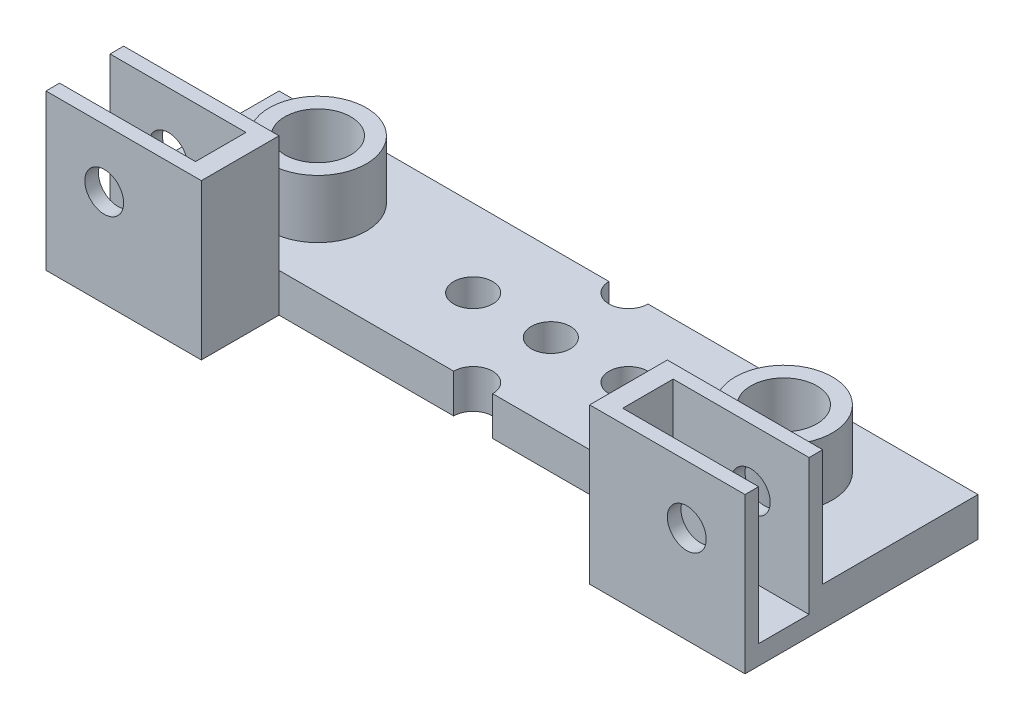
ISO-10303-21;
HEADER;
FILE_DESCRIPTION(('STEP AP214'),'2;1');
FILE_NAME('part.step','',(''),(''),'','','');
FILE_SCHEMA(('AUTOMOTIVE_DESIGN { 1 0 10303 214 1 1 1 1 }'));
ENDSEC;
DATA;
#1=APPLICATION_CONTEXT('core data for automotive mechanical design processes');
#2=APPLICATION_PROTOCOL_DEFINITION('international standard','automotive_design',2000,#1);
#3=PRODUCT_CONTEXT('',#1,'mechanical');
#4=PRODUCT('Part','Part','',(#3));
#5=PRODUCT_RELATED_PRODUCT_CATEGORY('part','',(#4));
#6=PRODUCT_DEFINITION_FORMATION('','',#4);
#7=PRODUCT_DEFINITION_CONTEXT('part definition',#1,'design');
#8=PRODUCT_DEFINITION('design','',#6,#7);
#9=PRODUCT_DEFINITION_SHAPE('','',#8);
#10=(LENGTH_UNIT() NAMED_UNIT(*) SI_UNIT(.MILLI.,.METRE.));
#11=(NAMED_UNIT(*) PLANE_ANGLE_UNIT() SI_UNIT($,.RADIAN.));
#12=(NAMED_UNIT(*) SI_UNIT($,.STERADIAN.) SOLID_ANGLE_UNIT());
#13=UNCERTAINTY_MEASURE_WITH_UNIT(LENGTH_MEASURE(1.E-05),#10,'distance_accuracy_value','');
#14=(GEOMETRIC_REPRESENTATION_CONTEXT(3) GLOBAL_UNCERTAINTY_ASSIGNED_CONTEXT((#13)) GLOBAL_UNIT_ASSIGNED_CONTEXT((#10,
#11,#12)) REPRESENTATION_CONTEXT('',''));
#15=CARTESIAN_POINT('',(0.,0.,0.));
#16=DIRECTION('',(0.,0.,1.));
#17=DIRECTION('',(1.,0.,0.));
#18=AXIS2_PLACEMENT_3D('',#15,#16,#17);
#19=CARTESIAN_POINT('',(45.,5.,0.));
#20=DIRECTION('',(1.,0.,0.));
#21=DIRECTION('',(0.,0.,-1.));
#22=AXIS2_PLACEMENT_3D('',#19,#20,#21);
#23=PLANE('',#22);
#24=DIRECTION('',(0.,0.,1.));
#25=VECTOR('',#24,1.);
#26=CARTESIAN_POINT('',(45.,2.5,0.));
#27=LINE('',#26,#25);
#28=CARTESIAN_POINT('',(45.,2.5,11.7499992255308));
#29=VERTEX_POINT('',#28);
#30=CARTESIAN_POINT('',(45.,2.5,18.2499992255308));
#31=VERTEX_POINT('',#30);
#32=EDGE_CURVE('E232',#29,#31,#27,.T.);
#33=ORIENTED_EDGE('',*,*,#32,.T.);
#34=DIRECTION('',(0.,1.,0.));
#35=VECTOR('',#34,1.);
#36=CARTESIAN_POINT('',(45.,-18.6681547025945,18.2499992255308));
#37=LINE('',#36,#35);
#38=CARTESIAN_POINT('',(45.,20.,18.2499992255308));
#39=VERTEX_POINT('',#38);
#40=EDGE_CURVE('E249',#31,#39,#37,.T.);
#41=ORIENTED_EDGE('',*,*,#40,.T.);
#42=DIRECTION('',(0.,0.,1.));
#43=VECTOR('',#42,1.);
#44=CARTESIAN_POINT('',(45.,20.,0.));
#45=LINE('',#44,#43);
#46=CARTESIAN_POINT('',(45.,20.,19.9999992255308));
#47=VERTEX_POINT('',#46);
#48=EDGE_CURVE('E297',#39,#47,#45,.T.);
#49=ORIENTED_EDGE('',*,*,#48,.T.);
#50=DIRECTION('',(0.,-1.,0.));
#51=VECTOR('',#50,1.);
#52=CARTESIAN_POINT('',(45.,20.,19.9999992255308));
#53=LINE('',#52,#51);
#54=CARTESIAN_POINT('',(45.,0.,19.9999992255308));
#55=VERTEX_POINT('',#54);
#56=EDGE_CURVE('E308',#47,#55,#53,.T.);
#57=ORIENTED_EDGE('',*,*,#56,.T.);
#58=DIRECTION('',(0.,0.,1.));
#59=VECTOR('',#58,1.);
#60=CARTESIAN_POINT('',(45.,0.,0.));
#61=LINE('',#60,#59);
#62=CARTESIAN_POINT('',(45.,0.,-10.0000007744691));
#63=VERTEX_POINT('',#62);
#64=EDGE_CURVE('E380',#63,#55,#61,.T.);
#65=ORIENTED_EDGE('',*,*,#64,.F.);
#66=DIRECTION('',(0.,-1.,0.));
#67=VECTOR('',#66,1.);
#68=CARTESIAN_POINT('',(45.,5.,-10.0000007744691));
#69=LINE('',#68,#67);
#70=CARTESIAN_POINT('',(45.,5.,-10.0000007744691));
#71=VERTEX_POINT('',#70);
#72=EDGE_CURVE('E47',#71,#63,#69,.T.);
#73=ORIENTED_EDGE('',*,*,#72,.F.);
#74=DIRECTION('',(0.,0.,1.));
#75=VECTOR('',#74,1.);
#76=CARTESIAN_POINT('',(45.,5.,0.));
#77=LINE('',#76,#75);
#78=CARTESIAN_POINT('',(45.,5.,9.99999922553084));
#79=VERTEX_POINT('',#78);
#80=EDGE_CURVE('E352',#71,#79,#77,.T.);
#81=ORIENTED_EDGE('',*,*,#80,.T.);
#82=DIRECTION('',(0.,-1.,0.));
#83=VECTOR('',#82,1.);
#84=CARTESIAN_POINT('',(45.,20.,9.99999922553084));
#85=LINE('',#84,#83);
#86=CARTESIAN_POINT('',(45.,20.,9.99999922553084));
#87=VERTEX_POINT('',#86);
#88=EDGE_CURVE('E301',#87,#79,#85,.T.);
#89=ORIENTED_EDGE('',*,*,#88,.F.);
#90=CARTESIAN_POINT('',(45.,20.,11.7499992255308));
#91=VERTEX_POINT('',#90);
#92=EDGE_CURVE('E298',#87,#91,#45,.T.);
#93=ORIENTED_EDGE('',*,*,#92,.T.);
#94=DIRECTION('',(0.,1.,0.));
#95=VECTOR('',#94,1.);
#96=CARTESIAN_POINT('',(45.,-18.6681547025945,11.7499992255308));
#97=LINE('',#96,#95);
#98=EDGE_CURVE('E63',#29,#91,#97,.T.);
#99=ORIENTED_EDGE('',*,*,#98,.F.);
#100=EDGE_LOOP('',(#33,#41,#49,#57,#65,#73,#81,#89,#93,#99));
#101=FACE_BOUND('',#100,.T.);
#102=ADVANCED_FACE('F38',(#101),#23,.T.);
#103=CARTESIAN_POINT('',(0.,20.,0.));
#104=DIRECTION('',(0.,1.,0.));
#105=DIRECTION('',(0.,0.,1.));
#106=AXIS2_PLACEMENT_3D('',#103,#104,#105);
#107=PLANE('',#106);
#108=ORIENTED_EDGE('',*,*,#48,.F.);
#109=DIRECTION('',(-1.,0.,0.));
#110=VECTOR('',#109,1.);
#111=CARTESIAN_POINT('',(0.,20.,18.2499992255308));
#112=LINE('',#111,#110);
#113=CARTESIAN_POINT('',(27.5,20.,18.2499992255308));
#114=VERTEX_POINT('',#113);
#115=EDGE_CURVE('E244',#39,#114,#112,.T.);
#116=ORIENTED_EDGE('',*,*,#115,.T.);
#117=DIRECTION('',(0.,0.,-1.));
#118=VECTOR('',#117,1.);
#119=CARTESIAN_POINT('',(27.5,20.,0.));
#120=LINE('',#119,#118);
#121=CARTESIAN_POINT('',(27.5,20.,11.7499992255308));
#122=VERTEX_POINT('',#121);
#123=EDGE_CURVE('E241',#114,#122,#120,.T.);
#124=ORIENTED_EDGE('',*,*,#123,.T.);
#125=DIRECTION('',(1.,0.,0.));
#126=VECTOR('',#125,1.);
#127=CARTESIAN_POINT('',(0.,20.,11.7499992255308));
#128=LINE('',#127,#126);
#129=EDGE_CURVE('E227',#122,#91,#128,.T.);
#130=ORIENTED_EDGE('',*,*,#129,.T.);
#131=ORIENTED_EDGE('',*,*,#92,.F.);
#132=DIRECTION('',(1.,0.,0.));
#133=VECTOR('',#132,1.);
#134=CARTESIAN_POINT('',(0.,20.,9.99999922553084));
#135=LINE('',#134,#133);
#136=CARTESIAN_POINT('',(25.,20.,9.99999922553084));
#137=VERTEX_POINT('',#136);
#138=EDGE_CURVE('E287',#137,#87,#135,.T.);
#139=ORIENTED_EDGE('',*,*,#138,.F.);
#140=DIRECTION('',(0.,0.,-1.));
#141=VECTOR('',#140,1.);
#142=CARTESIAN_POINT('',(25.,20.,0.));
#143=LINE('',#142,#141);
#144=CARTESIAN_POINT('',(25.,20.,19.9999992255308));
#145=VERTEX_POINT('',#144);
#146=EDGE_CURVE('E290',#145,#137,#143,.T.);
#147=ORIENTED_EDGE('',*,*,#146,.F.);
#148=DIRECTION('',(1.,0.,0.));
#149=VECTOR('',#148,1.);
#150=CARTESIAN_POINT('',(0.,20.,19.9999992255308));
#151=LINE('',#150,#149);
#152=EDGE_CURVE('E294',#145,#47,#151,.T.);
#153=ORIENTED_EDGE('',*,*,#152,.T.);
#154=EDGE_LOOP('',(#108,#116,#124,#130,#131,#139,#147,#153));
#155=FACE_BOUND('',#154,.T.);
#156=ADVANCED_FACE('F452',(#155),#107,.T.);
#157=CARTESIAN_POINT('',(0.,5.,9.99999922553085));
#158=DIRECTION('',(0.,-1.,0.));
#159=DIRECTION('',(0.,0.,-1.));
#160=AXIS2_PLACEMENT_3D('',#157,#158,#159);
#161=CYLINDRICAL_SURFACE('',#160,2.51);
#162=CARTESIAN_POINT('',(0.,0.,9.99999922553085));
#163=DIRECTION('',(0.,1.,0.));
#164=DIRECTION('',(0.,0.,1.));
#165=AXIS2_PLACEMENT_3D('',#162,#163,#164);
#166=CIRCLE('',#165,2.51);
#167=CARTESIAN_POINT('',(2.51,0.,9.99999922553084));
#168=VERTEX_POINT('',#167);
#169=CARTESIAN_POINT('',(-2.51,0.,9.99999922553084));
#170=VERTEX_POINT('',#169);
#171=EDGE_CURVE('E342',#168,#170,#166,.T.);
#172=ORIENTED_EDGE('',*,*,#171,.F.);
#173=DIRECTION('',(0.,-1.,0.));
#174=VECTOR('',#173,1.);
#175=CARTESIAN_POINT('',(2.51,5.,9.99999922553084));
#176=LINE('',#175,#174);
#177=CARTESIAN_POINT('',(2.51,5.,9.99999922553084));
#178=VERTEX_POINT('',#177);
#179=EDGE_CURVE('E12',#178,#168,#176,.T.);
#180=ORIENTED_EDGE('',*,*,#179,.F.);
#181=CARTESIAN_POINT('',(0.,5.,9.99999922553085));
#182=DIRECTION('',(0.,1.,0.));
#183=DIRECTION('',(0.,0.,1.));
#184=AXIS2_PLACEMENT_3D('',#181,#182,#183);
#185=CIRCLE('',#184,2.51);
#186=CARTESIAN_POINT('',(-2.51,5.,9.99999922553084));
#187=VERTEX_POINT('',#186);
#188=EDGE_CURVE('E345',#178,#187,#185,.T.);
#189=ORIENTED_EDGE('',*,*,#188,.T.);
#190=DIRECTION('',(0.,-1.,0.));
#191=VECTOR('',#190,1.);
#192=CARTESIAN_POINT('',(-2.51,5.,9.99999922553084));
#193=LINE('',#192,#191);
#194=EDGE_CURVE('E375',#187,#170,#193,.T.);
#195=ORIENTED_EDGE('',*,*,#194,.T.);
#196=EDGE_LOOP('',(#172,#180,#189,#195));
#197=FACE_BOUND('',#196,.T.);
#198=ADVANCED_FACE('F40',(#197),#161,.F.);
#199=CARTESIAN_POINT('',(0.,5.,9.99999922553084));
#200=DIRECTION('',(0.,0.,-1.));
#201=DIRECTION('',(-1.,0.,0.));
#202=AXIS2_PLACEMENT_3D('',#199,#200,#201);
#203=PLANE('',#202);
#204=DIRECTION('',(1.,0.,0.));
#205=VECTOR('',#204,1.);
#206=CARTESIAN_POINT('',(0.,0.,9.99999922553084));
#207=LINE('',#206,#205);
#208=CARTESIAN_POINT('',(25.,0.,9.99999922553084));
#209=VERTEX_POINT('',#208);
#210=EDGE_CURVE('E378',#168,#209,#207,.T.);
#211=ORIENTED_EDGE('',*,*,#210,.T.);
#212=DIRECTION('',(0.,-1.,0.));
#213=VECTOR('',#212,1.);
#214=CARTESIAN_POINT('',(25.,20.,9.99999922553084));
#215=LINE('',#214,#213);
#216=CARTESIAN_POINT('',(25.,5.,9.99999922553084));
#217=VERTEX_POINT('',#216);
#218=EDGE_CURVE('E313',#217,#209,#215,.T.);
#219=ORIENTED_EDGE('',*,*,#218,.F.);
#220=DIRECTION('',(1.,0.,0.));
#221=VECTOR('',#220,1.);
#222=CARTESIAN_POINT('',(0.,5.,9.99999922553084));
#223=LINE('',#222,#221);
#224=EDGE_CURVE('E348',#178,#217,#223,.T.);
#225=ORIENTED_EDGE('',*,*,#224,.F.);
#226=ORIENTED_EDGE('',*,*,#179,.T.);
#227=EDGE_LOOP('',(#211,#219,#225,#226));
#228=FACE_BOUND('',#227,.T.);
#229=ADVANCED_FACE('F478',(#228),#203,.F.);
#230=CARTESIAN_POINT('',(0.,5.,-10.0000007744691));
#231=DIRECTION('',(0.,0.,-1.));
#232=DIRECTION('',(-1.,0.,0.));
#233=AXIS2_PLACEMENT_3D('',#230,#231,#232);
#234=PLANE('',#233);
#235=DIRECTION('',(1.,0.,0.));
#236=VECTOR('',#235,1.);
#237=CARTESIAN_POINT('',(0.,0.,-10.0000007744691));
#238=LINE('',#237,#236);
#239=CARTESIAN_POINT('',(2.51,0.,-10.0000007744691));
#240=VERTEX_POINT('',#239);
#241=EDGE_CURVE('E383',#240,#63,#238,.T.);
#242=ORIENTED_EDGE('',*,*,#241,.F.);
#243=DIRECTION('',(0.,-1.,0.));
#244=VECTOR('',#243,1.);
#245=CARTESIAN_POINT('',(2.51,5.,-10.0000007744691));
#246=LINE('',#245,#244);
#247=CARTESIAN_POINT('',(2.51,5.,-10.0000007744691));
#248=VERTEX_POINT('',#247);
#249=EDGE_CURVE('E406',#248,#240,#246,.T.);
#250=ORIENTED_EDGE('',*,*,#249,.F.);
#251=DIRECTION('',(1.,0.,0.));
#252=VECTOR('',#251,1.);
#253=CARTESIAN_POINT('',(0.,5.,-10.0000007744691));
#254=LINE('',#253,#252);
#255=EDGE_CURVE('E357',#248,#71,#254,.T.);
#256=ORIENTED_EDGE('',*,*,#255,.T.);
#257=ORIENTED_EDGE('',*,*,#72,.T.);
#258=EDGE_LOOP('',(#242,#250,#256,#257));
#259=FACE_BOUND('',#258,.T.);
#260=ADVANCED_FACE('F464',(#259),#234,.T.);
#261=CARTESIAN_POINT('',(0.,5.,-10.0000007744691));
#262=DIRECTION('',(0.,-1.,0.));
#263=DIRECTION('',(0.,0.,-1.));
#264=AXIS2_PLACEMENT_3D('',#261,#262,#263);
#265=CYLINDRICAL_SURFACE('',#264,2.51);
#266=CARTESIAN_POINT('',(0.,0.,-10.0000007744691));
#267=DIRECTION('',(0.,1.,0.));
#268=DIRECTION('',(0.,0.,1.));
#269=AXIS2_PLACEMENT_3D('',#266,#267,#268);
#270=CIRCLE('',#269,2.51);
#271=CARTESIAN_POINT('',(-2.51,0.,-10.0000007744691));
#272=VERTEX_POINT('',#271);
#273=EDGE_CURVE('E386',#272,#240,#270,.T.);
#274=ORIENTED_EDGE('',*,*,#273,.F.);
#275=DIRECTION('',(0.,-1.,0.));
#276=VECTOR('',#275,1.);
#277=CARTESIAN_POINT('',(-2.51,5.,-10.0000007744691));
#278=LINE('',#277,#276);
#279=CARTESIAN_POINT('',(-2.51,5.,-10.0000007744691));
#280=VERTEX_POINT('',#279);
#281=EDGE_CURVE('E404',#280,#272,#278,.T.);
#282=ORIENTED_EDGE('',*,*,#281,.F.);
#283=CARTESIAN_POINT('',(0.,5.,-10.0000007744691));
#284=DIRECTION('',(0.,1.,0.));
#285=DIRECTION('',(0.,0.,1.));
#286=AXIS2_PLACEMENT_3D('',#283,#284,#285);
#287=CIRCLE('',#286,2.51);
#288=EDGE_CURVE('E360',#280,#248,#287,.T.);
#289=ORIENTED_EDGE('',*,*,#288,.T.);
#290=ORIENTED_EDGE('',*,*,#249,.T.);
#291=EDGE_LOOP('',(#274,#282,#289,#290));
#292=FACE_BOUND('',#291,.T.);
#293=ADVANCED_FACE('F460',(#292),#265,.F.);
#294=CARTESIAN_POINT('',(-45.,0.,-10.0000007744691));
#295=VERTEX_POINT('',#294);
#296=EDGE_CURVE('E387',#295,#272,#238,.T.);
#297=ORIENTED_EDGE('',*,*,#296,.F.);
#298=DIRECTION('',(0.,-1.,0.));
#299=VECTOR('',#298,1.);
#300=CARTESIAN_POINT('',(-45.,5.,-10.0000007744691));
#301=LINE('',#300,#299);
#302=CARTESIAN_POINT('',(-45.,5.,-10.0000007744691));
#303=VERTEX_POINT('',#302);
#304=EDGE_CURVE('E402',#303,#295,#301,.T.);
#305=ORIENTED_EDGE('',*,*,#304,.F.);
#306=EDGE_CURVE('E361',#303,#280,#254,.T.);
#307=ORIENTED_EDGE('',*,*,#306,.T.);
#308=ORIENTED_EDGE('',*,*,#281,.T.);
#309=EDGE_LOOP('',(#297,#305,#307,#308));
#310=FACE_BOUND('',#309,.T.);
#311=ADVANCED_FACE('F463',(#310),#234,.T.);
#312=CARTESIAN_POINT('',(-45.,5.,0.));
#313=DIRECTION('',(1.,0.,0.));
#314=DIRECTION('',(0.,0.,-1.));
#315=AXIS2_PLACEMENT_3D('',#312,#313,#314);
#316=PLANE('',#315);
#317=DIRECTION('',(0.,0.,-1.));
#318=VECTOR('',#317,1.);
#319=CARTESIAN_POINT('',(-45.,2.5,0.));
#320=LINE('',#319,#318);
#321=CARTESIAN_POINT('',(-45.,2.5,18.2499992255308));
#322=VERTEX_POINT('',#321);
#323=CARTESIAN_POINT('',(-45.,2.5,11.7499992255308));
#324=VERTEX_POINT('',#323);
#325=EDGE_CURVE('E228',#322,#324,#320,.T.);
#326=ORIENTED_EDGE('',*,*,#325,.T.);
#327=DIRECTION('',(0.,1.,0.));
#328=VECTOR('',#327,1.);
#329=CARTESIAN_POINT('',(-45.,-18.6681547025945,11.7499992255308));
#330=LINE('',#329,#328);
#331=CARTESIAN_POINT('',(-45.,20.,11.7499992255308));
#332=VERTEX_POINT('',#331);
#333=EDGE_CURVE('E220',#324,#332,#330,.T.);
#334=ORIENTED_EDGE('',*,*,#333,.T.);
#335=DIRECTION('',(0.,0.,1.));
#336=VECTOR('',#335,1.);
#337=CARTESIAN_POINT('',(-45.,20.,0.));
#338=LINE('',#337,#336);
#339=CARTESIAN_POINT('',(-45.,20.,9.99999922553084));
#340=VERTEX_POINT('',#339);
#341=EDGE_CURVE('E262',#340,#332,#338,.T.);
#342=ORIENTED_EDGE('',*,*,#341,.F.);
#343=DIRECTION('',(0.,-1.,0.));
#344=VECTOR('',#343,1.);
#345=CARTESIAN_POINT('',(-45.,20.,9.99999922553084));
#346=LINE('',#345,#344);
#347=CARTESIAN_POINT('',(-45.,5.,9.99999922553084));
#348=VERTEX_POINT('',#347);
#349=EDGE_CURVE('E283',#340,#348,#346,.T.);
#350=ORIENTED_EDGE('',*,*,#349,.T.);
#351=DIRECTION('',(0.,0.,1.));
#352=VECTOR('',#351,1.);
#353=CARTESIAN_POINT('',(-45.,5.,0.));
#354=LINE('',#353,#352);
#355=EDGE_CURVE('E364',#303,#348,#354,.T.);
#356=ORIENTED_EDGE('',*,*,#355,.F.);
#357=ORIENTED_EDGE('',*,*,#304,.T.);
#358=DIRECTION('',(0.,0.,1.));
#359=VECTOR('',#358,1.);
#360=CARTESIAN_POINT('',(-45.,0.,0.));
#361=LINE('',#360,#359);
#362=CARTESIAN_POINT('',(-45.,0.,19.9999992255309));
#363=VERTEX_POINT('',#362);
#364=EDGE_CURVE('E390',#295,#363,#361,.T.);
#365=ORIENTED_EDGE('',*,*,#364,.T.);
#366=DIRECTION('',(0.,-1.,0.));
#367=VECTOR('',#366,1.);
#368=CARTESIAN_POINT('',(-45.,20.,19.9999992255309));
#369=LINE('',#368,#367);
#370=CARTESIAN_POINT('',(-45.,20.,19.9999992255309));
#371=VERTEX_POINT('',#370);
#372=EDGE_CURVE('E280',#371,#363,#369,.T.);
#373=ORIENTED_EDGE('',*,*,#372,.F.);
#374=CARTESIAN_POINT('',(-45.,20.,18.2499992255308));
#375=VERTEX_POINT('',#374);
#376=EDGE_CURVE('E260',#375,#371,#338,.T.);
#377=ORIENTED_EDGE('',*,*,#376,.F.);
#378=DIRECTION('',(0.,1.,0.));
#379=VECTOR('',#378,1.);
#380=CARTESIAN_POINT('',(-45.,-18.6681547025945,18.2499992255308));
#381=LINE('',#380,#379);
#382=EDGE_CURVE('E55',#322,#375,#381,.T.);
#383=ORIENTED_EDGE('',*,*,#382,.F.);
#384=EDGE_LOOP('',(#326,#334,#342,#350,#356,#357,#365,#373,#377,#383));
#385=FACE_BOUND('',#384,.T.);
#386=ADVANCED_FACE('F430',(#385),#316,.F.);
#387=CARTESIAN_POINT('',(10.,5.,-7.74469148100837E-07));
#388=DIRECTION('',(0.,-1.,0.));
#389=DIRECTION('',(0.,0.,-1.));
#390=AXIS2_PLACEMENT_3D('',#387,#388,#389);
#391=CYLINDRICAL_SURFACE('',#390,2.51);
#392=CARTESIAN_POINT('',(10.,5.,-7.74469148100837E-07));
#393=DIRECTION('',(0.,1.,0.));
#394=DIRECTION('',(0.,0.,1.));
#395=AXIS2_PLACEMENT_3D('',#392,#393,#394);
#396=CIRCLE('',#395,2.51);
#397=CARTESIAN_POINT('',(10.,5.,2.50999922553085));
#398=VERTEX_POINT('',#397);
#399=EDGE_CURVE('E369',#398,#398,#396,.T.);
#400=ORIENTED_EDGE('',*,*,#399,.T.);
#401=EDGE_LOOP('',(#400));
#402=FACE_BOUND('',#401,.T.);
#403=CARTESIAN_POINT('',(10.,0.,-7.74469148100837E-07));
#404=DIRECTION('',(0.,1.,0.));
#405=DIRECTION('',(0.,0.,1.));
#406=AXIS2_PLACEMENT_3D('',#403,#404,#405);
#407=CIRCLE('',#406,2.51);
#408=CARTESIAN_POINT('',(10.,0.,2.50999922553085));
#409=VERTEX_POINT('',#408);
#410=EDGE_CURVE('E395',#409,#409,#407,.T.);
#411=ORIENTED_EDGE('',*,*,#410,.F.);
#412=EDGE_LOOP('',(#411));
#413=FACE_BOUND('',#412,.T.);
#414=ADVANCED_FACE('F471',(#402,#413),#391,.F.);
#415=CARTESIAN_POINT('',(-10.,5.,-7.74469148100837E-07));
#416=DIRECTION('',(0.,-1.,0.));
#417=DIRECTION('',(0.,0.,-1.));
#418=AXIS2_PLACEMENT_3D('',#415,#416,#417);
#419=CYLINDRICAL_SURFACE('',#418,2.51);
#420=CARTESIAN_POINT('',(-10.,5.,-7.74469148100837E-07));
#421=DIRECTION('',(0.,1.,0.));
#422=DIRECTION('',(0.,0.,1.));
#423=AXIS2_PLACEMENT_3D('',#420,#421,#422);
#424=CIRCLE('',#423,2.51);
#425=CARTESIAN_POINT('',(-10.,5.,2.50999922553085));
#426=VERTEX_POINT('',#425);
#427=EDGE_CURVE('E366',#426,#426,#424,.T.);
#428=ORIENTED_EDGE('',*,*,#427,.T.);
#429=EDGE_LOOP('',(#428));
#430=FACE_BOUND('',#429,.T.);
#431=CARTESIAN_POINT('',(-10.,0.,-7.74469148100837E-07));
#432=DIRECTION('',(0.,1.,0.));
#433=DIRECTION('',(0.,0.,1.));
#434=AXIS2_PLACEMENT_3D('',#431,#432,#433);
#435=CIRCLE('',#434,2.51);
#436=CARTESIAN_POINT('',(-10.,0.,2.50999922553085));
#437=VERTEX_POINT('',#436);
#438=EDGE_CURVE('E392',#437,#437,#435,.T.);
#439=ORIENTED_EDGE('',*,*,#438,.F.);
#440=EDGE_LOOP('',(#439));
#441=FACE_BOUND('',#440,.T.);
#442=ADVANCED_FACE('F476',(#430,#441),#419,.F.);
#443=CARTESIAN_POINT('',(-25.,5.,9.99999922553084));
#444=VERTEX_POINT('',#443);
#445=EDGE_CURVE('E353',#444,#187,#223,.T.);
#446=ORIENTED_EDGE('',*,*,#445,.F.);
#447=DIRECTION('',(0.,-1.,0.));
#448=VECTOR('',#447,1.);
#449=CARTESIAN_POINT('',(-25.,20.,9.99999922553084));
#450=LINE('',#449,#448);
#451=CARTESIAN_POINT('',(-25.,0.,9.99999922553084));
#452=VERTEX_POINT('',#451);
#453=EDGE_CURVE('E270',#444,#452,#450,.T.);
#454=ORIENTED_EDGE('',*,*,#453,.T.);
#455=EDGE_CURVE('E381',#452,#170,#207,.T.);
#456=ORIENTED_EDGE('',*,*,#455,.T.);
#457=ORIENTED_EDGE('',*,*,#194,.F.);
#458=EDGE_LOOP('',(#446,#454,#456,#457));
#459=FACE_BOUND('',#458,.T.);
#460=ADVANCED_FACE('F472',(#459),#203,.F.);
#461=CARTESIAN_POINT('',(0.,5.,-7.74469148100837E-07));
#462=DIRECTION('',(0.,-1.,0.));
#463=DIRECTION('',(0.,0.,-1.));
#464=AXIS2_PLACEMENT_3D('',#461,#462,#463);
#465=CYLINDRICAL_SURFACE('',#464,2.51);
#466=CARTESIAN_POINT('',(0.,5.,-7.74469148100837E-07));
#467=DIRECTION('',(0.,1.,0.));
#468=DIRECTION('',(0.,0.,1.));
#469=AXIS2_PLACEMENT_3D('',#466,#467,#468);
#470=CIRCLE('',#469,2.51);
#471=CARTESIAN_POINT('',(0.,5.,2.50999922553085));
#472=VERTEX_POINT('',#471);
#473=EDGE_CURVE('E372',#472,#472,#470,.T.);
#474=ORIENTED_EDGE('',*,*,#473,.T.);
#475=EDGE_LOOP('',(#474));
#476=FACE_BOUND('',#475,.T.);
#477=CARTESIAN_POINT('',(0.,0.,-7.74469148100837E-07));
#478=DIRECTION('',(0.,1.,0.));
#479=DIRECTION('',(0.,0.,1.));
#480=AXIS2_PLACEMENT_3D('',#477,#478,#479);
#481=CIRCLE('',#480,2.51);
#482=CARTESIAN_POINT('',(0.,0.,2.50999922553085));
#483=VERTEX_POINT('',#482);
#484=EDGE_CURVE('E349',#483,#483,#481,.T.);
#485=ORIENTED_EDGE('',*,*,#484,.F.);
#486=EDGE_LOOP('',(#485));
#487=FACE_BOUND('',#486,.T.);
#488=ADVANCED_FACE('F475',(#476,#487),#465,.F.);
#489=CARTESIAN_POINT('',(0.,5.,0.));
#490=DIRECTION('',(0.,1.,0.));
#491=DIRECTION('',(0.,0.,1.));
#492=AXIS2_PLACEMENT_3D('',#489,#490,#491);
#493=PLANE('',#492);
#494=CARTESIAN_POINT('',(30.,5.,0.));
#495=DIRECTION('',(0.,1.,0.));
#496=DIRECTION('',(0.,0.,1.));
#497=AXIS2_PLACEMENT_3D('',#494,#495,#496);
#498=CIRCLE('',#497,6.25);
#499=CARTESIAN_POINT('',(30.,5.,6.25));
#500=VERTEX_POINT('',#499);
#501=EDGE_CURVE('E326',#500,#500,#498,.T.);
#502=ORIENTED_EDGE('',*,*,#501,.F.);
#503=EDGE_LOOP('',(#502));
#504=FACE_BOUND('',#503,.T.);
#505=CARTESIAN_POINT('',(-30.,5.,0.));
#506=DIRECTION('',(0.,1.,0.));
#507=DIRECTION('',(0.,0.,1.));
#508=AXIS2_PLACEMENT_3D('',#505,#506,#507);
#509=CIRCLE('',#508,6.25);
#510=CARTESIAN_POINT('',(-30.,5.,6.25));
#511=VERTEX_POINT('',#510);
#512=EDGE_CURVE('E333',#511,#511,#509,.T.);
#513=ORIENTED_EDGE('',*,*,#512,.F.);
#514=EDGE_LOOP('',(#513));
#515=FACE_BOUND('',#514,.T.);
#516=ORIENTED_EDGE('',*,*,#188,.F.);
#517=ORIENTED_EDGE('',*,*,#224,.T.);
#518=DIRECTION('',(-1.,0.,0.));
#519=VECTOR('',#518,1.);
#520=CARTESIAN_POINT('',(0.,5.,9.99999922553084));
#521=LINE('',#520,#519);
#522=EDGE_CURVE('E317',#79,#217,#521,.T.);
#523=ORIENTED_EDGE('',*,*,#522,.F.);
#524=ORIENTED_EDGE('',*,*,#80,.F.);
#525=ORIENTED_EDGE('',*,*,#255,.F.);
#526=ORIENTED_EDGE('',*,*,#288,.F.);
#527=ORIENTED_EDGE('',*,*,#306,.F.);
#528=ORIENTED_EDGE('',*,*,#355,.T.);
#529=EDGE_CURVE('E354',#348,#444,#223,.T.);
#530=ORIENTED_EDGE('',*,*,#529,.T.);
#531=ORIENTED_EDGE('',*,*,#445,.T.);
#532=EDGE_LOOP('',(#516,#517,#523,#524,#525,#526,#527,#528,#530,#531));
#533=FACE_BOUND('',#532,.T.);
#534=ORIENTED_EDGE('',*,*,#427,.F.);
#535=EDGE_LOOP('',(#534));
#536=FACE_BOUND('',#535,.T.);
#537=ORIENTED_EDGE('',*,*,#399,.F.);
#538=EDGE_LOOP('',(#537));
#539=FACE_BOUND('',#538,.T.);
#540=ORIENTED_EDGE('',*,*,#473,.F.);
#541=EDGE_LOOP('',(#540));
#542=FACE_BOUND('',#541,.T.);
#543=ADVANCED_FACE('F487',(#504,#515,#533,#536,#539,#542),#493,.T.);
#544=CARTESIAN_POINT('',(0.,0.,0.));
#545=DIRECTION('',(0.,1.,0.));
#546=DIRECTION('',(0.,0.,1.));
#547=AXIS2_PLACEMENT_3D('',#544,#545,#546);
#548=PLANE('',#547);
#549=CARTESIAN_POINT('',(30.,0.,0.));
#550=DIRECTION('',(0.,1.,0.));
#551=DIRECTION('',(0.,0.,1.));
#552=AXIS2_PLACEMENT_3D('',#549,#550,#551);
#553=CIRCLE('',#552,4.25);
#554=CARTESIAN_POINT('',(30.,0.,4.25));
#555=VERTEX_POINT('',#554);
#556=EDGE_CURVE('E320',#555,#555,#553,.T.);
#557=ORIENTED_EDGE('',*,*,#556,.T.);
#558=EDGE_LOOP('',(#557));
#559=FACE_BOUND('',#558,.T.);
#560=CARTESIAN_POINT('',(-30.,0.,0.));
#561=DIRECTION('',(0.,1.,0.));
#562=DIRECTION('',(0.,0.,1.));
#563=AXIS2_PLACEMENT_3D('',#560,#561,#562);
#564=CIRCLE('',#563,4.25);
#565=CARTESIAN_POINT('',(-30.,0.,4.25));
#566=VERTEX_POINT('',#565);
#567=EDGE_CURVE('E323',#566,#566,#564,.T.);
#568=ORIENTED_EDGE('',*,*,#567,.T.);
#569=EDGE_LOOP('',(#568));
#570=FACE_BOUND('',#569,.T.);
#571=ORIENTED_EDGE('',*,*,#171,.T.);
#572=ORIENTED_EDGE('',*,*,#455,.F.);
#573=DIRECTION('',(0.,0.,1.));
#574=VECTOR('',#573,1.);
#575=CARTESIAN_POINT('',(-25.,0.,0.));
#576=LINE('',#575,#574);
#577=CARTESIAN_POINT('',(-25.,0.,19.9999992255309));
#578=VERTEX_POINT('',#577);
#579=EDGE_CURVE('E261',#452,#578,#576,.T.);
#580=ORIENTED_EDGE('',*,*,#579,.T.);
#581=DIRECTION('',(-1.,0.,0.));
#582=VECTOR('',#581,1.);
#583=CARTESIAN_POINT('',(0.,0.,19.9999992255309));
#584=LINE('',#583,#582);
#585=EDGE_CURVE('E239',#578,#363,#584,.T.);
#586=ORIENTED_EDGE('',*,*,#585,.T.);
#587=ORIENTED_EDGE('',*,*,#364,.F.);
#588=ORIENTED_EDGE('',*,*,#296,.T.);
#589=ORIENTED_EDGE('',*,*,#273,.T.);
#590=ORIENTED_EDGE('',*,*,#241,.T.);
#591=ORIENTED_EDGE('',*,*,#64,.T.);
#592=DIRECTION('',(1.,0.,0.));
#593=VECTOR('',#592,1.);
#594=CARTESIAN_POINT('',(0.,0.,19.9999992255308));
#595=LINE('',#594,#593);
#596=CARTESIAN_POINT('',(25.,0.,19.9999992255308));
#597=VERTEX_POINT('',#596);
#598=EDGE_CURVE('E291',#597,#55,#595,.T.);
#599=ORIENTED_EDGE('',*,*,#598,.F.);
#600=DIRECTION('',(0.,0.,-1.));
#601=VECTOR('',#600,1.);
#602=CARTESIAN_POINT('',(25.,0.,0.));
#603=LINE('',#602,#601);
#604=EDGE_CURVE('E286',#597,#209,#603,.T.);
#605=ORIENTED_EDGE('',*,*,#604,.T.);
#606=ORIENTED_EDGE('',*,*,#210,.F.);
#607=EDGE_LOOP('',(#571,#572,#580,#586,#587,#588,#589,#590,#591,#599,#605,#606));
#608=FACE_BOUND('',#607,.T.);
#609=ORIENTED_EDGE('',*,*,#438,.T.);
#610=EDGE_LOOP('',(#609));
#611=FACE_BOUND('',#610,.T.);
#612=ORIENTED_EDGE('',*,*,#410,.T.);
#613=EDGE_LOOP('',(#612));
#614=FACE_BOUND('',#613,.T.);
#615=ORIENTED_EDGE('',*,*,#484,.T.);
#616=EDGE_LOOP('',(#615));
#617=FACE_BOUND('',#616,.T.);
#618=ADVANCED_FACE('F489',(#559,#570,#608,#611,#614,#617),#548,.F.);
#619=CARTESIAN_POINT('',(-30.,12.5,0.));
#620=DIRECTION('',(0.,-1.,0.));
#621=DIRECTION('',(0.,0.,-1.));
#622=AXIS2_PLACEMENT_3D('',#619,#620,#621);
#623=CYLINDRICAL_SURFACE('',#622,4.25);
#624=CARTESIAN_POINT('',(-30.,12.5,0.));
#625=DIRECTION('',(0.,1.,0.));
#626=DIRECTION('',(0.,0.,1.));
#627=AXIS2_PLACEMENT_3D('',#624,#625,#626);
#628=CIRCLE('',#627,4.25);
#629=CARTESIAN_POINT('',(-30.,12.5,4.25));
#630=VERTEX_POINT('',#629);
#631=EDGE_CURVE('E336',#630,#630,#628,.T.);
#632=ORIENTED_EDGE('',*,*,#631,.T.);
#633=EDGE_LOOP('',(#632));
#634=FACE_BOUND('',#633,.T.);
#635=ORIENTED_EDGE('',*,*,#567,.F.);
#636=EDGE_LOOP('',(#635));
#637=FACE_BOUND('',#636,.T.);
#638=ADVANCED_FACE('F492',(#634,#637),#623,.F.);
#639=CARTESIAN_POINT('',(-30.,12.5,0.));
#640=DIRECTION('',(0.,-1.,0.));
#641=DIRECTION('',(0.,0.,-1.));
#642=AXIS2_PLACEMENT_3D('',#639,#640,#641);
#643=CYLINDRICAL_SURFACE('',#642,6.25);
#644=CARTESIAN_POINT('',(-30.,12.5,0.));
#645=DIRECTION('',(0.,1.,0.));
#646=DIRECTION('',(0.,0.,1.));
#647=AXIS2_PLACEMENT_3D('',#644,#645,#646);
#648=CIRCLE('',#647,6.25);
#649=CARTESIAN_POINT('',(-30.,12.5,6.25));
#650=VERTEX_POINT('',#649);
#651=EDGE_CURVE('E339',#650,#650,#648,.T.);
#652=ORIENTED_EDGE('',*,*,#651,.F.);
#653=EDGE_LOOP('',(#652));
#654=FACE_BOUND('',#653,.T.);
#655=ORIENTED_EDGE('',*,*,#512,.T.);
#656=EDGE_LOOP('',(#655));
#657=FACE_BOUND('',#656,.T.);
#658=ADVANCED_FACE('F499',(#654,#657),#643,.T.);
#659=CARTESIAN_POINT('',(0.,12.5,0.));
#660=DIRECTION('',(0.,1.,0.));
#661=DIRECTION('',(0.,0.,1.));
#662=AXIS2_PLACEMENT_3D('',#659,#660,#661);
#663=PLANE('',#662);
#664=ORIENTED_EDGE('',*,*,#631,.F.);
#665=EDGE_LOOP('',(#664));
#666=FACE_BOUND('',#665,.T.);
#667=ORIENTED_EDGE('',*,*,#651,.T.);
#668=EDGE_LOOP('',(#667));
#669=FACE_BOUND('',#668,.T.);
#670=ADVANCED_FACE('F503',(#666,#669),#663,.T.);
#671=CARTESIAN_POINT('',(30.,12.5,0.));
#672=DIRECTION('',(0.,-1.,0.));
#673=DIRECTION('',(0.,0.,-1.));
#674=AXIS2_PLACEMENT_3D('',#671,#672,#673);
#675=CYLINDRICAL_SURFACE('',#674,4.25);
#676=CARTESIAN_POINT('',(30.,12.5,0.));
#677=DIRECTION('',(0.,1.,0.));
#678=DIRECTION('',(0.,0.,1.));
#679=AXIS2_PLACEMENT_3D('',#676,#677,#678);
#680=CIRCLE('',#679,4.25);
#681=CARTESIAN_POINT('',(30.,12.5,4.25));
#682=VERTEX_POINT('',#681);
#683=EDGE_CURVE('E327',#682,#682,#680,.T.);
#684=ORIENTED_EDGE('',*,*,#683,.T.);
#685=EDGE_LOOP('',(#684));
#686=FACE_BOUND('',#685,.T.);
#687=ORIENTED_EDGE('',*,*,#556,.F.);
#688=EDGE_LOOP('',(#687));
#689=FACE_BOUND('',#688,.T.);
#690=ADVANCED_FACE('F507',(#686,#689),#675,.F.);
#691=CARTESIAN_POINT('',(30.,12.5,0.));
#692=DIRECTION('',(0.,-1.,0.));
#693=DIRECTION('',(0.,0.,-1.));
#694=AXIS2_PLACEMENT_3D('',#691,#692,#693);
#695=CYLINDRICAL_SURFACE('',#694,6.25);
#696=CARTESIAN_POINT('',(30.,12.5,0.));
#697=DIRECTION('',(0.,1.,0.));
#698=DIRECTION('',(0.,0.,1.));
#699=AXIS2_PLACEMENT_3D('',#696,#697,#698);
#700=CIRCLE('',#699,6.25);
#701=CARTESIAN_POINT('',(30.,12.5,6.25));
#702=VERTEX_POINT('',#701);
#703=EDGE_CURVE('E330',#702,#702,#700,.T.);
#704=ORIENTED_EDGE('',*,*,#703,.F.);
#705=EDGE_LOOP('',(#704));
#706=FACE_BOUND('',#705,.T.);
#707=ORIENTED_EDGE('',*,*,#501,.T.);
#708=EDGE_LOOP('',(#707));
#709=FACE_BOUND('',#708,.T.);
#710=ADVANCED_FACE('F511',(#706,#709),#695,.T.);
#711=CARTESIAN_POINT('',(0.,12.5,0.));
#712=DIRECTION('',(0.,1.,0.));
#713=DIRECTION('',(0.,0.,1.));
#714=AXIS2_PLACEMENT_3D('',#711,#712,#713);
#715=PLANE('',#714);
#716=ORIENTED_EDGE('',*,*,#683,.F.);
#717=EDGE_LOOP('',(#716));
#718=FACE_BOUND('',#717,.T.);
#719=ORIENTED_EDGE('',*,*,#703,.T.);
#720=EDGE_LOOP('',(#719));
#721=FACE_BOUND('',#720,.T.);
#722=ADVANCED_FACE('F515',(#718,#721),#715,.T.);
#723=CARTESIAN_POINT('',(0.,20.,9.99999922553084));
#724=DIRECTION('',(0.,0.,-1.));
#725=DIRECTION('',(-1.,0.,0.));
#726=AXIS2_PLACEMENT_3D('',#723,#724,#725);
#727=PLANE('',#726);
#728=CARTESIAN_POINT('',(37.5,12.5,9.99999922553084));
#729=DIRECTION('',(0.,0.,-1.));
#730=DIRECTION('',(-1.,0.,0.));
#731=AXIS2_PLACEMENT_3D('',#728,#729,#730);
#732=CIRCLE('',#731,2.5);
#733=CARTESIAN_POINT('',(35.,12.5,9.99999922553084));
#734=VERTEX_POINT('',#733);
#735=EDGE_CURVE('E410',#734,#734,#732,.F.);
#736=ORIENTED_EDGE('',*,*,#735,.T.);
#737=EDGE_LOOP('',(#736));
#738=FACE_BOUND('',#737,.T.);
#739=ORIENTED_EDGE('',*,*,#88,.T.);
#740=ORIENTED_EDGE('',*,*,#522,.T.);
#741=EDGE_CURVE('E314',#137,#217,#215,.T.);
#742=ORIENTED_EDGE('',*,*,#741,.F.);
#743=ORIENTED_EDGE('',*,*,#138,.T.);
#744=EDGE_LOOP('',(#739,#740,#742,#743));
#745=FACE_BOUND('',#744,.T.);
#746=ADVANCED_FACE('F519',(#738,#745),#727,.T.);
#747=CARTESIAN_POINT('',(25.,20.,0.));
#748=DIRECTION('',(-1.,0.,0.));
#749=DIRECTION('',(0.,0.,1.));
#750=AXIS2_PLACEMENT_3D('',#747,#748,#749);
#751=PLANE('',#750);
#752=ORIENTED_EDGE('',*,*,#604,.F.);
#753=DIRECTION('',(0.,-1.,0.));
#754=VECTOR('',#753,1.);
#755=CARTESIAN_POINT('',(25.,20.,19.9999992255308));
#756=LINE('',#755,#754);
#757=EDGE_CURVE('E311',#145,#597,#756,.T.);
#758=ORIENTED_EDGE('',*,*,#757,.F.);
#759=ORIENTED_EDGE('',*,*,#146,.T.);
#760=ORIENTED_EDGE('',*,*,#741,.T.);
#761=ORIENTED_EDGE('',*,*,#218,.T.);
#762=EDGE_LOOP('',(#752,#758,#759,#760,#761));
#763=FACE_BOUND('',#762,.T.);
#764=ADVANCED_FACE('F523',(#763),#751,.T.);
#765=CARTESIAN_POINT('',(0.,20.,19.9999992255308));
#766=DIRECTION('',(0.,0.,-1.));
#767=DIRECTION('',(-1.,0.,0.));
#768=AXIS2_PLACEMENT_3D('',#765,#766,#767);
#769=PLANE('',#768);
#770=CARTESIAN_POINT('',(37.5,12.5,19.9999992255308));
#771=DIRECTION('',(0.,0.,1.));
#772=DIRECTION('',(1.,0.,0.));
#773=AXIS2_PLACEMENT_3D('',#770,#771,#772);
#774=CIRCLE('',#773,2.5);
#775=CARTESIAN_POINT('',(40.,12.5,19.9999992255308));
#776=VERTEX_POINT('',#775);
#777=EDGE_CURVE('E416',#776,#776,#774,.T.);
#778=ORIENTED_EDGE('',*,*,#777,.F.);
#779=EDGE_LOOP('',(#778));
#780=FACE_BOUND('',#779,.T.);
#781=ORIENTED_EDGE('',*,*,#598,.T.);
#782=ORIENTED_EDGE('',*,*,#56,.F.);
#783=ORIENTED_EDGE('',*,*,#152,.F.);
#784=ORIENTED_EDGE('',*,*,#757,.T.);
#785=EDGE_LOOP('',(#781,#782,#783,#784));
#786=FACE_BOUND('',#785,.T.);
#787=ADVANCED_FACE('F526',(#780,#786),#769,.F.);
#788=CARTESIAN_POINT('',(0.,20.,9.99999922553084));
#789=DIRECTION('',(0.,0.,-1.));
#790=DIRECTION('',(-1.,0.,0.));
#791=AXIS2_PLACEMENT_3D('',#788,#789,#790);
#792=PLANE('',#791);
#793=CARTESIAN_POINT('',(-37.5,12.5,9.99999922553084));
#794=DIRECTION('',(0.,0.,-1.));
#795=DIRECTION('',(-1.,0.,0.));
#796=AXIS2_PLACEMENT_3D('',#793,#794,#795);
#797=CIRCLE('',#796,2.5);
#798=CARTESIAN_POINT('',(-40.,12.5,9.99999922553084));
#799=VERTEX_POINT('',#798);
#800=EDGE_CURVE('E565',#799,#799,#797,.T.);
#801=ORIENTED_EDGE('',*,*,#800,.F.);
#802=EDGE_LOOP('',(#801));
#803=FACE_BOUND('',#802,.T.);
#804=CARTESIAN_POINT('',(-25.,20.,9.99999922553084));
#805=VERTEX_POINT('',#804);
#806=EDGE_CURVE('E275',#805,#444,#450,.T.);
#807=ORIENTED_EDGE('',*,*,#806,.T.);
#808=ORIENTED_EDGE('',*,*,#529,.F.);
#809=ORIENTED_EDGE('',*,*,#349,.F.);
#810=DIRECTION('',(1.,0.,0.));
#811=VECTOR('',#810,1.);
#812=CARTESIAN_POINT('',(0.,20.,9.99999922553084));
#813=LINE('',#812,#811);
#814=EDGE_CURVE('E257',#340,#805,#813,.T.);
#815=ORIENTED_EDGE('',*,*,#814,.T.);
#816=EDGE_LOOP('',(#807,#808,#809,#815));
#817=FACE_BOUND('',#816,.T.);
#818=ADVANCED_FACE('F529',(#803,#817),#792,.T.);
#819=CARTESIAN_POINT('',(0.,20.,19.9999992255309));
#820=DIRECTION('',(0.,0.,1.));
#821=DIRECTION('',(1.,0.,0.));
#822=AXIS2_PLACEMENT_3D('',#819,#820,#821);
#823=PLANE('',#822);
#824=CARTESIAN_POINT('',(-37.5,12.5,19.9999992255308));
#825=DIRECTION('',(0.,0.,1.));
#826=DIRECTION('',(1.,0.,0.));
#827=AXIS2_PLACEMENT_3D('',#824,#825,#826);
#828=CIRCLE('',#827,2.5);
#829=CARTESIAN_POINT('',(-35.,12.5,19.9999992255308));
#830=VERTEX_POINT('',#829);
#831=EDGE_CURVE('E568',#830,#830,#828,.F.);
#832=ORIENTED_EDGE('',*,*,#831,.T.);
#833=EDGE_LOOP('',(#832));
#834=FACE_BOUND('',#833,.T.);
#835=ORIENTED_EDGE('',*,*,#585,.F.);
#836=DIRECTION('',(0.,-1.,0.));
#837=VECTOR('',#836,1.);
#838=CARTESIAN_POINT('',(-25.,20.,19.9999992255309));
#839=LINE('',#838,#837);
#840=CARTESIAN_POINT('',(-25.,20.,19.9999992255309));
#841=VERTEX_POINT('',#840);
#842=EDGE_CURVE('E278',#841,#578,#839,.T.);
#843=ORIENTED_EDGE('',*,*,#842,.F.);
#844=DIRECTION('',(-1.,0.,0.));
#845=VECTOR('',#844,1.);
#846=CARTESIAN_POINT('',(0.,20.,19.9999992255309));
#847=LINE('',#846,#845);
#848=EDGE_CURVE('E264',#841,#371,#847,.T.);
#849=ORIENTED_EDGE('',*,*,#848,.T.);
#850=ORIENTED_EDGE('',*,*,#372,.T.);
#851=EDGE_LOOP('',(#835,#843,#849,#850));
#852=FACE_BOUND('',#851,.T.);
#853=ADVANCED_FACE('F534',(#834,#852),#823,.T.);
#854=CARTESIAN_POINT('',(-25.,20.,0.));
#855=DIRECTION('',(1.,0.,0.));
#856=DIRECTION('',(0.,0.,-1.));
#857=AXIS2_PLACEMENT_3D('',#854,#855,#856);
#858=PLANE('',#857);
#859=ORIENTED_EDGE('',*,*,#579,.F.);
#860=ORIENTED_EDGE('',*,*,#453,.F.);
#861=ORIENTED_EDGE('',*,*,#806,.F.);
#862=DIRECTION('',(0.,0.,1.));
#863=VECTOR('',#862,1.);
#864=CARTESIAN_POINT('',(-25.,20.,0.));
#865=LINE('',#864,#863);
#866=EDGE_CURVE('E267',#805,#841,#865,.T.);
#867=ORIENTED_EDGE('',*,*,#866,.T.);
#868=ORIENTED_EDGE('',*,*,#842,.T.);
#869=EDGE_LOOP('',(#859,#860,#861,#867,#868));
#870=FACE_BOUND('',#869,.T.);
#871=ADVANCED_FACE('F538',(#870),#858,.T.);
#872=CARTESIAN_POINT('',(0.,20.,0.));
#873=DIRECTION('',(0.,1.,0.));
#874=DIRECTION('',(0.,0.,1.));
#875=AXIS2_PLACEMENT_3D('',#872,#873,#874);
#876=PLANE('',#875);
#877=DIRECTION('',(-1.,0.,0.));
#878=VECTOR('',#877,1.);
#879=CARTESIAN_POINT('',(0.,20.,11.7499992255308));
#880=LINE('',#879,#878);
#881=CARTESIAN_POINT('',(-27.5,20.,11.7499992255308));
#882=VERTEX_POINT('',#881);
#883=EDGE_CURVE('E215',#882,#332,#880,.T.);
#884=ORIENTED_EDGE('',*,*,#883,.F.);
#885=DIRECTION('',(0.,0.,-1.));
#886=VECTOR('',#885,1.);
#887=CARTESIAN_POINT('',(-27.5,20.,0.));
#888=LINE('',#887,#886);
#889=CARTESIAN_POINT('',(-27.5,20.,18.2499992255308));
#890=VERTEX_POINT('',#889);
#891=EDGE_CURVE('E200',#890,#882,#888,.T.);
#892=ORIENTED_EDGE('',*,*,#891,.F.);
#893=DIRECTION('',(1.,0.,0.));
#894=VECTOR('',#893,1.);
#895=CARTESIAN_POINT('',(0.,20.,18.2499992255308));
#896=LINE('',#895,#894);
#897=EDGE_CURVE('E207',#375,#890,#896,.T.);
#898=ORIENTED_EDGE('',*,*,#897,.F.);
#899=ORIENTED_EDGE('',*,*,#376,.T.);
#900=ORIENTED_EDGE('',*,*,#848,.F.);
#901=ORIENTED_EDGE('',*,*,#866,.F.);
#902=ORIENTED_EDGE('',*,*,#814,.F.);
#903=ORIENTED_EDGE('',*,*,#341,.T.);
#904=EDGE_LOOP('',(#884,#892,#898,#899,#900,#901,#902,#903));
#905=FACE_BOUND('',#904,.T.);
#906=ADVANCED_FACE('F213',(#905),#876,.T.);
#907=CARTESIAN_POINT('',(27.5,-18.6681547025945,0.));
#908=DIRECTION('',(1.,0.,0.));
#909=DIRECTION('',(0.,0.,-1.));
#910=AXIS2_PLACEMENT_3D('',#907,#908,#909);
#911=PLANE('',#910);
#912=DIRECTION('',(0.,1.,0.));
#913=VECTOR('',#912,1.);
#914=CARTESIAN_POINT('',(27.5,-18.6681547025945,11.7499992255308));
#915=LINE('',#914,#913);
#916=CARTESIAN_POINT('',(27.5,2.5,11.7499992255308));
#917=VERTEX_POINT('',#916);
#918=EDGE_CURVE('E247',#917,#122,#915,.T.);
#919=ORIENTED_EDGE('',*,*,#918,.T.);
#920=ORIENTED_EDGE('',*,*,#123,.F.);
#921=DIRECTION('',(0.,1.,0.));
#922=VECTOR('',#921,1.);
#923=CARTESIAN_POINT('',(27.5,-18.6681547025945,18.2499992255308));
#924=LINE('',#923,#922);
#925=CARTESIAN_POINT('',(27.5,2.5,18.2499992255308));
#926=VERTEX_POINT('',#925);
#927=EDGE_CURVE('E252',#926,#114,#924,.T.);
#928=ORIENTED_EDGE('',*,*,#927,.F.);
#929=DIRECTION('',(0.,0.,1.));
#930=VECTOR('',#929,1.);
#931=CARTESIAN_POINT('',(27.5,2.5,0.));
#932=LINE('',#931,#930);
#933=EDGE_CURVE('E233',#917,#926,#932,.T.);
#934=ORIENTED_EDGE('',*,*,#933,.F.);
#935=EDGE_LOOP('',(#919,#920,#928,#934));
#936=FACE_BOUND('',#935,.T.);
#937=ADVANCED_FACE('F545',(#936),#911,.T.);
#938=CARTESIAN_POINT('',(0.,-18.6681547025945,18.2499992255308));
#939=DIRECTION('',(0.,0.,-1.));
#940=DIRECTION('',(-1.,0.,0.));
#941=AXIS2_PLACEMENT_3D('',#938,#939,#940);
#942=PLANE('',#941);
#943=CARTESIAN_POINT('',(37.5,12.5,18.2499992255308));
#944=DIRECTION('',(0.,0.,-1.));
#945=DIRECTION('',(-1.,0.,0.));
#946=AXIS2_PLACEMENT_3D('',#943,#944,#945);
#947=CIRCLE('',#946,2.5);
#948=CARTESIAN_POINT('',(35.,12.5,18.2499992255308));
#949=VERTEX_POINT('',#948);
#950=EDGE_CURVE('E211',#949,#949,#947,.T.);
#951=ORIENTED_EDGE('',*,*,#950,.F.);
#952=EDGE_LOOP('',(#951));
#953=FACE_BOUND('',#952,.T.);
#954=ORIENTED_EDGE('',*,*,#927,.T.);
#955=ORIENTED_EDGE('',*,*,#115,.F.);
#956=ORIENTED_EDGE('',*,*,#40,.F.);
#957=DIRECTION('',(1.,0.,0.));
#958=VECTOR('',#957,1.);
#959=CARTESIAN_POINT('',(0.,2.5,18.2499992255308));
#960=LINE('',#959,#958);
#961=EDGE_CURVE('E229',#926,#31,#960,.T.);
#962=ORIENTED_EDGE('',*,*,#961,.F.);
#963=EDGE_LOOP('',(#954,#955,#956,#962));
#964=FACE_BOUND('',#963,.T.);
#965=ADVANCED_FACE('F548',(#953,#964),#942,.T.);
#966=CARTESIAN_POINT('',(0.,-18.6681547025945,11.7499992255308));
#967=DIRECTION('',(0.,0.,1.));
#968=DIRECTION('',(1.,0.,0.));
#969=AXIS2_PLACEMENT_3D('',#966,#967,#968);
#970=PLANE('',#969);
#971=CARTESIAN_POINT('',(37.5,12.5,11.7499992255308));
#972=DIRECTION('',(0.,0.,1.));
#973=DIRECTION('',(1.,0.,0.));
#974=AXIS2_PLACEMENT_3D('',#971,#972,#973);
#975=CIRCLE('',#974,2.5);
#976=CARTESIAN_POINT('',(40.,12.5,11.7499992255308));
#977=VERTEX_POINT('',#976);
#978=EDGE_CURVE('E408',#977,#977,#975,.T.);
#979=ORIENTED_EDGE('',*,*,#978,.F.);
#980=EDGE_LOOP('',(#979));
#981=FACE_BOUND('',#980,.T.);
#982=ORIENTED_EDGE('',*,*,#98,.T.);
#983=ORIENTED_EDGE('',*,*,#129,.F.);
#984=ORIENTED_EDGE('',*,*,#918,.F.);
#985=DIRECTION('',(-1.,0.,0.));
#986=VECTOR('',#985,1.);
#987=CARTESIAN_POINT('',(0.,2.5,11.7499992255308));
#988=LINE('',#987,#986);
#989=EDGE_CURVE('E236',#29,#917,#988,.T.);
#990=ORIENTED_EDGE('',*,*,#989,.F.);
#991=EDGE_LOOP('',(#982,#983,#984,#990));
#992=FACE_BOUND('',#991,.T.);
#993=ADVANCED_FACE('F446',(#981,#992),#970,.T.);
#994=CARTESIAN_POINT('',(0.,2.5,0.));
#995=DIRECTION('',(0.,1.,0.));
#996=DIRECTION('',(0.,0.,1.));
#997=AXIS2_PLACEMENT_3D('',#994,#995,#996);
#998=PLANE('',#997);
#999=ORIENTED_EDGE('',*,*,#32,.F.);
#1000=ORIENTED_EDGE('',*,*,#989,.T.);
#1001=ORIENTED_EDGE('',*,*,#933,.T.);
#1002=ORIENTED_EDGE('',*,*,#961,.T.);
#1003=EDGE_LOOP('',(#999,#1000,#1001,#1002));
#1004=FACE_BOUND('',#1003,.T.);
#1005=ADVANCED_FACE('F438',(#1004),#998,.T.);
#1006=CARTESIAN_POINT('',(0.,-18.6681547025945,11.7499992255308));
#1007=DIRECTION('',(0.,0.,-1.));
#1008=DIRECTION('',(-1.,0.,0.));
#1009=AXIS2_PLACEMENT_3D('',#1006,#1007,#1008);
#1010=PLANE('',#1009);
#1011=CARTESIAN_POINT('',(-37.5,12.5,11.7499992255308));
#1012=DIRECTION('',(0.,0.,-1.));
#1013=DIRECTION('',(-1.,0.,0.));
#1014=AXIS2_PLACEMENT_3D('',#1011,#1012,#1013);
#1015=CIRCLE('',#1014,2.5);
#1016=CARTESIAN_POINT('',(-40.,12.5,11.7499992255308));
#1017=VERTEX_POINT('',#1016);
#1018=EDGE_CURVE('E421',#1017,#1017,#1015,.F.);
#1019=ORIENTED_EDGE('',*,*,#1018,.F.);
#1020=EDGE_LOOP('',(#1019));
#1021=FACE_BOUND('',#1020,.T.);
#1022=DIRECTION('',(1.,0.,0.));
#1023=VECTOR('',#1022,1.);
#1024=CARTESIAN_POINT('',(0.,2.5,11.7499992255308));
#1025=LINE('',#1024,#1023);
#1026=CARTESIAN_POINT('',(-27.5,2.5,11.7499992255308));
#1027=VERTEX_POINT('',#1026);
#1028=EDGE_CURVE('E426',#324,#1027,#1025,.T.);
#1029=ORIENTED_EDGE('',*,*,#1028,.T.);
#1030=DIRECTION('',(0.,1.,0.));
#1031=VECTOR('',#1030,1.);
#1032=CARTESIAN_POINT('',(-27.5,-18.6681547025945,11.7499992255308));
#1033=LINE('',#1032,#1031);
#1034=EDGE_CURVE('E205',#1027,#882,#1033,.T.);
#1035=ORIENTED_EDGE('',*,*,#1034,.T.);
#1036=ORIENTED_EDGE('',*,*,#883,.T.);
#1037=ORIENTED_EDGE('',*,*,#333,.F.);
#1038=EDGE_LOOP('',(#1029,#1035,#1036,#1037));
#1039=FACE_BOUND('',#1038,.T.);
#1040=ADVANCED_FACE('F436',(#1021,#1039),#1010,.F.);
#1041=CARTESIAN_POINT('',(-27.5,-18.6681547025945,0.));
#1042=DIRECTION('',(1.,0.,0.));
#1043=DIRECTION('',(0.,0.,-1.));
#1044=AXIS2_PLACEMENT_3D('',#1041,#1042,#1043);
#1045=PLANE('',#1044);
#1046=DIRECTION('',(0.,0.,1.));
#1047=VECTOR('',#1046,1.);
#1048=CARTESIAN_POINT('',(-27.5,2.5,0.));
#1049=LINE('',#1048,#1047);
#1050=CARTESIAN_POINT('',(-27.5,2.5,18.2499992255308));
#1051=VERTEX_POINT('',#1050);
#1052=EDGE_CURVE('E203',#1027,#1051,#1049,.T.);
#1053=ORIENTED_EDGE('',*,*,#1052,.T.);
#1054=DIRECTION('',(0.,1.,0.));
#1055=VECTOR('',#1054,1.);
#1056=CARTESIAN_POINT('',(-27.5,-18.6681547025945,18.2499992255308));
#1057=LINE('',#1056,#1055);
#1058=EDGE_CURVE('E196',#1051,#890,#1057,.T.);
#1059=ORIENTED_EDGE('',*,*,#1058,.T.);
#1060=ORIENTED_EDGE('',*,*,#891,.T.);
#1061=ORIENTED_EDGE('',*,*,#1034,.F.);
#1062=EDGE_LOOP('',(#1053,#1059,#1060,#1061));
#1063=FACE_BOUND('',#1062,.T.);
#1064=ADVANCED_FACE('F197',(#1063),#1045,.F.);
#1065=CARTESIAN_POINT('',(0.,-18.6681547025945,18.2499992255308));
#1066=DIRECTION('',(0.,0.,1.));
#1067=DIRECTION('',(1.,0.,0.));
#1068=AXIS2_PLACEMENT_3D('',#1065,#1066,#1067);
#1069=PLANE('',#1068);
#1070=CARTESIAN_POINT('',(-37.5,12.5,18.2499992255308));
#1071=DIRECTION('',(0.,0.,1.));
#1072=DIRECTION('',(1.,0.,0.));
#1073=AXIS2_PLACEMENT_3D('',#1070,#1071,#1072);
#1074=CIRCLE('',#1073,2.5);
#1075=CARTESIAN_POINT('',(-35.,12.5,18.2499992255308));
#1076=VERTEX_POINT('',#1075);
#1077=EDGE_CURVE('E42',#1076,#1076,#1074,.F.);
#1078=ORIENTED_EDGE('',*,*,#1077,.F.);
#1079=EDGE_LOOP('',(#1078));
#1080=FACE_BOUND('',#1079,.T.);
#1081=DIRECTION('',(-1.,0.,0.));
#1082=VECTOR('',#1081,1.);
#1083=CARTESIAN_POINT('',(0.,2.5,18.2499992255308));
#1084=LINE('',#1083,#1082);
#1085=EDGE_CURVE('E225',#1051,#322,#1084,.T.);
#1086=ORIENTED_EDGE('',*,*,#1085,.T.);
#1087=ORIENTED_EDGE('',*,*,#382,.T.);
#1088=ORIENTED_EDGE('',*,*,#897,.T.);
#1089=ORIENTED_EDGE('',*,*,#1058,.F.);
#1090=EDGE_LOOP('',(#1086,#1087,#1088,#1089));
#1091=FACE_BOUND('',#1090,.T.);
#1092=ADVANCED_FACE('F208',(#1080,#1091),#1069,.F.);
#1093=CARTESIAN_POINT('',(0.,2.5,0.));
#1094=DIRECTION('',(0.,1.,0.));
#1095=DIRECTION('',(0.,0.,1.));
#1096=AXIS2_PLACEMENT_3D('',#1093,#1094,#1095);
#1097=PLANE('',#1096);
#1098=ORIENTED_EDGE('',*,*,#325,.F.);
#1099=ORIENTED_EDGE('',*,*,#1085,.F.);
#1100=ORIENTED_EDGE('',*,*,#1052,.F.);
#1101=ORIENTED_EDGE('',*,*,#1028,.F.);
#1102=EDGE_LOOP('',(#1098,#1099,#1100,#1101));
#1103=FACE_BOUND('',#1102,.T.);
#1104=ADVANCED_FACE('F434',(#1103),#1097,.T.);
#1105=CARTESIAN_POINT('',(37.5,12.5,2.92893141366536));
#1106=DIRECTION('',(0.,0.,1.));
#1107=DIRECTION('',(1.,0.,0.));
#1108=AXIS2_PLACEMENT_3D('',#1105,#1106,#1107);
#1109=CYLINDRICAL_SURFACE('',#1108,2.5);
#1110=ORIENTED_EDGE('',*,*,#978,.T.);
#1111=EDGE_LOOP('',(#1110));
#1112=FACE_BOUND('',#1111,.T.);
#1113=ORIENTED_EDGE('',*,*,#735,.F.);
#1114=EDGE_LOOP('',(#1113));
#1115=FACE_BOUND('',#1114,.T.);
#1116=ADVANCED_FACE('F561',(#1112,#1115),#1109,.F.);
#1117=ORIENTED_EDGE('',*,*,#950,.T.);
#1118=EDGE_LOOP('',(#1117));
#1119=FACE_BOUND('',#1118,.T.);
#1120=ORIENTED_EDGE('',*,*,#777,.T.);
#1121=EDGE_LOOP('',(#1120));
#1122=FACE_BOUND('',#1121,.T.);
#1123=ADVANCED_FACE('F580',(#1119,#1122),#1109,.F.);
#1124=CARTESIAN_POINT('',(-37.5,12.5,2.92893141366536));
#1125=DIRECTION('',(0.,0.,1.));
#1126=DIRECTION('',(1.,0.,0.));
#1127=AXIS2_PLACEMENT_3D('',#1124,#1125,#1126);
#1128=CYLINDRICAL_SURFACE('',#1127,2.5);
#1129=ORIENTED_EDGE('',*,*,#831,.F.);
#1130=EDGE_LOOP('',(#1129));
#1131=FACE_BOUND('',#1130,.T.);
#1132=ORIENTED_EDGE('',*,*,#1077,.T.);
#1133=EDGE_LOOP('',(#1132));
#1134=FACE_BOUND('',#1133,.T.);
#1135=ADVANCED_FACE('F577',(#1131,#1134),#1128,.F.);
#1136=ORIENTED_EDGE('',*,*,#800,.T.);
#1137=EDGE_LOOP('',(#1136));
#1138=FACE_BOUND('',#1137,.T.);
#1139=ORIENTED_EDGE('',*,*,#1018,.T.);
#1140=EDGE_LOOP('',(#1139));
#1141=FACE_BOUND('',#1140,.T.);
#1142=ADVANCED_FACE('F579',(#1138,#1141),#1128,.F.);
#1143=CLOSED_SHELL('',(#102,#156,#198,#229,#260,#293,#311,#386,#414,#442,#460,#488,#543,#618,
#638,#658,#670,#690,#710,#722,#746,#764,#787,#818,#853,#871,#906,#937,#965,#993,#1005,#1040,
#1064,#1092,#1104,#1116,#1123,#1135,#1142));
#1144=MANIFOLD_SOLID_BREP('B2',#1143);
#1145=ADVANCED_BREP_SHAPE_REPRESENTATION('',(#18,#1144),#14);
#1146=SHAPE_DEFINITION_REPRESENTATION(#9,#1145);
ENDSEC;
END-ISO-10303-21;
